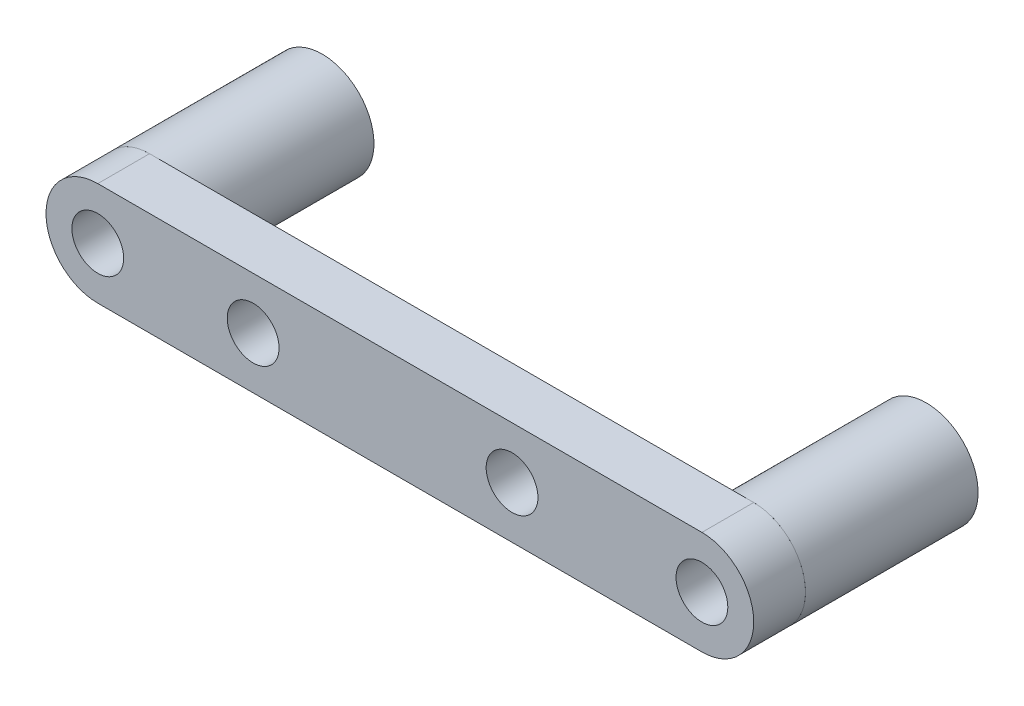
ISO-10303-21;
HEADER;
FILE_DESCRIPTION(('STEP AP214'),'2;1');
FILE_NAME('part.step','',(''),(''),'','','');
FILE_SCHEMA(('AUTOMOTIVE_DESIGN { 1 0 10303 214 1 1 1 1 }'));
ENDSEC;
DATA;
#1=APPLICATION_CONTEXT('core data for automotive mechanical design processes');
#2=APPLICATION_PROTOCOL_DEFINITION('international standard','automotive_design',2000,#1);
#3=PRODUCT_CONTEXT('',#1,'mechanical');
#4=PRODUCT('Part','Part','',(#3));
#5=PRODUCT_RELATED_PRODUCT_CATEGORY('part','',(#4));
#6=PRODUCT_DEFINITION_FORMATION('','',#4);
#7=PRODUCT_DEFINITION_CONTEXT('part definition',#1,'design');
#8=PRODUCT_DEFINITION('design','',#6,#7);
#9=PRODUCT_DEFINITION_SHAPE('','',#8);
#10=(LENGTH_UNIT() NAMED_UNIT(*) SI_UNIT(.MILLI.,.METRE.));
#11=(NAMED_UNIT(*) PLANE_ANGLE_UNIT() SI_UNIT($,.RADIAN.));
#12=(NAMED_UNIT(*) SI_UNIT($,.STERADIAN.) SOLID_ANGLE_UNIT());
#13=UNCERTAINTY_MEASURE_WITH_UNIT(LENGTH_MEASURE(1.E-05),#10,'distance_accuracy_value','');
#14=(GEOMETRIC_REPRESENTATION_CONTEXT(3) GLOBAL_UNCERTAINTY_ASSIGNED_CONTEXT((#13)) GLOBAL_UNIT_ASSIGNED_CONTEXT((#10,
#11,#12)) REPRESENTATION_CONTEXT('',''));
#15=CARTESIAN_POINT('',(0.,0.,0.));
#16=DIRECTION('',(0.,0.,1.));
#17=DIRECTION('',(1.,0.,0.));
#18=AXIS2_PLACEMENT_3D('',#15,#16,#17);
#19=CARTESIAN_POINT('',(18.5,0.,-10.));
#20=DIRECTION('',(0.,0.,-1.));
#21=DIRECTION('',(-1.,0.,0.));
#22=AXIS2_PLACEMENT_3D('',#19,#20,#21);
#23=PLANE('',#22);
#24=CARTESIAN_POINT('',(18.5,0.,-10.));
#25=DIRECTION('',(0.,0.,-1.));
#26=DIRECTION('',(-1.,0.,0.));
#27=AXIS2_PLACEMENT_3D('',#24,#25,#26);
#28=CIRCLE('',#27,3.);
#29=CARTESIAN_POINT('',(15.5,0.,-10.));
#30=VERTEX_POINT('',#29);
#31=EDGE_CURVE('E11',#30,#30,#28,.T.);
#32=ORIENTED_EDGE('',*,*,#31,.T.);
#33=EDGE_LOOP('',(#32));
#34=FACE_BOUND('',#33,.T.);
#35=CARTESIAN_POINT('',(18.5,0.,-10.));
#36=DIRECTION('',(0.,0.,-1.));
#37=DIRECTION('',(-1.,0.,0.));
#38=AXIS2_PLACEMENT_3D('',#35,#36,#37);
#39=CIRCLE('',#38,1.5);
#40=CARTESIAN_POINT('',(17.,0.,-10.));
#41=VERTEX_POINT('',#40);
#42=EDGE_CURVE('E50',#41,#41,#39,.T.);
#43=ORIENTED_EDGE('',*,*,#42,.F.);
#44=EDGE_LOOP('',(#43));
#45=FACE_BOUND('',#44,.T.);
#46=ADVANCED_FACE('F39',(#34,#45),#23,.T.);
#47=CARTESIAN_POINT('',(18.5,0.,0.));
#48=DIRECTION('',(0.,0.,-1.));
#49=DIRECTION('',(-1.,0.,0.));
#50=AXIS2_PLACEMENT_3D('',#47,#48,#49);
#51=PLANE('',#50);
#52=CARTESIAN_POINT('',(18.5,0.,0.));
#53=DIRECTION('',(0.,0.,-1.));
#54=DIRECTION('',(-1.,0.,0.));
#55=AXIS2_PLACEMENT_3D('',#52,#53,#54);
#56=CIRCLE('',#55,3.);
#57=CARTESIAN_POINT('',(15.5,0.,0.));
#58=VERTEX_POINT('',#57);
#59=EDGE_CURVE('E43',#58,#58,#56,.T.);
#60=ORIENTED_EDGE('',*,*,#59,.F.);
#61=EDGE_LOOP('',(#60));
#62=FACE_BOUND('',#61,.T.);
#63=CARTESIAN_POINT('',(18.5,0.,0.));
#64=DIRECTION('',(0.,0.,-1.));
#65=DIRECTION('',(-1.,0.,0.));
#66=AXIS2_PLACEMENT_3D('',#63,#64,#65);
#67=CIRCLE('',#66,1.5);
#68=CARTESIAN_POINT('',(17.,0.,0.));
#69=VERTEX_POINT('',#68);
#70=EDGE_CURVE('E52',#69,#69,#67,.T.);
#71=ORIENTED_EDGE('',*,*,#70,.T.);
#72=EDGE_LOOP('',(#71));
#73=FACE_BOUND('',#72,.T.);
#74=ADVANCED_FACE('F62',(#62,#73),#51,.F.);
#75=CARTESIAN_POINT('',(18.5,0.,-10.));
#76=DIRECTION('',(0.,0.,1.));
#77=DIRECTION('',(1.,0.,0.));
#78=AXIS2_PLACEMENT_3D('',#75,#76,#77);
#79=CYLINDRICAL_SURFACE('',#78,3.);
#80=ORIENTED_EDGE('',*,*,#31,.F.);
#81=EDGE_LOOP('',(#80));
#82=FACE_BOUND('',#81,.T.);
#83=ORIENTED_EDGE('',*,*,#59,.T.);
#84=EDGE_LOOP('',(#83));
#85=FACE_BOUND('',#84,.T.);
#86=ADVANCED_FACE('F41',(#82,#85),#79,.T.);
#87=CARTESIAN_POINT('',(18.5,0.,-10.));
#88=DIRECTION('',(0.,0.,1.));
#89=DIRECTION('',(1.,0.,0.));
#90=AXIS2_PLACEMENT_3D('',#87,#88,#89);
#91=CYLINDRICAL_SURFACE('',#90,1.5);
#92=ORIENTED_EDGE('',*,*,#42,.T.);
#93=EDGE_LOOP('',(#92));
#94=FACE_BOUND('',#93,.T.);
#95=ORIENTED_EDGE('',*,*,#70,.F.);
#96=EDGE_LOOP('',(#95));
#97=FACE_BOUND('',#96,.T.);
#98=ADVANCED_FACE('F58',(#94,#97),#91,.F.);
#99=CLOSED_SHELL('',(#46,#74,#86,#98));
#100=MANIFOLD_SOLID_BREP('B2',#99);
#101=CARTESIAN_POINT('',(-16.5,0.,-10.));
#102=DIRECTION('',(0.,0.,-1.));
#103=DIRECTION('',(-1.,0.,0.));
#104=AXIS2_PLACEMENT_3D('',#101,#102,#103);
#105=PLANE('',#104);
#106=CARTESIAN_POINT('',(-16.5,0.,-10.));
#107=DIRECTION('',(0.,0.,-1.));
#108=DIRECTION('',(-1.,0.,0.));
#109=AXIS2_PLACEMENT_3D('',#106,#107,#108);
#110=CIRCLE('',#109,2.99999999999999);
#111=CARTESIAN_POINT('',(-19.5,0.,-10.));
#112=VERTEX_POINT('',#111);
#113=EDGE_CURVE('E38',#112,#112,#110,.T.);
#114=ORIENTED_EDGE('',*,*,#113,.T.);
#115=EDGE_LOOP('',(#114));
#116=FACE_BOUND('',#115,.T.);
#117=CARTESIAN_POINT('',(-16.5,0.,-10.));
#118=DIRECTION('',(0.,0.,-1.));
#119=DIRECTION('',(-1.,0.,0.));
#120=AXIS2_PLACEMENT_3D('',#117,#118,#119);
#121=CIRCLE('',#120,1.5);
#122=CARTESIAN_POINT('',(-18.,0.,-10.));
#123=VERTEX_POINT('',#122);
#124=EDGE_CURVE('E120',#123,#123,#121,.T.);
#125=ORIENTED_EDGE('',*,*,#124,.F.);
#126=EDGE_LOOP('',(#125));
#127=FACE_BOUND('',#126,.T.);
#128=ADVANCED_FACE('F109',(#116,#127),#105,.T.);
#129=CARTESIAN_POINT('',(-16.5,0.,0.));
#130=DIRECTION('',(0.,0.,-1.));
#131=DIRECTION('',(-1.,0.,0.));
#132=AXIS2_PLACEMENT_3D('',#129,#130,#131);
#133=PLANE('',#132);
#134=CARTESIAN_POINT('',(-16.5,0.,0.));
#135=DIRECTION('',(0.,0.,-1.));
#136=DIRECTION('',(-1.,0.,0.));
#137=AXIS2_PLACEMENT_3D('',#134,#135,#136);
#138=CIRCLE('',#137,2.99999999999999);
#139=CARTESIAN_POINT('',(-19.5,0.,0.));
#140=VERTEX_POINT('',#139);
#141=EDGE_CURVE('E113',#140,#140,#138,.T.);
#142=ORIENTED_EDGE('',*,*,#141,.F.);
#143=EDGE_LOOP('',(#142));
#144=FACE_BOUND('',#143,.T.);
#145=CARTESIAN_POINT('',(-16.5,0.,0.));
#146=DIRECTION('',(0.,0.,-1.));
#147=DIRECTION('',(-1.,0.,0.));
#148=AXIS2_PLACEMENT_3D('',#145,#146,#147);
#149=CIRCLE('',#148,1.5);
#150=CARTESIAN_POINT('',(-18.,0.,0.));
#151=VERTEX_POINT('',#150);
#152=EDGE_CURVE('E122',#151,#151,#149,.T.);
#153=ORIENTED_EDGE('',*,*,#152,.T.);
#154=EDGE_LOOP('',(#153));
#155=FACE_BOUND('',#154,.T.);
#156=ADVANCED_FACE('F132',(#144,#155),#133,.F.);
#157=CARTESIAN_POINT('',(-16.5,0.,-10.));
#158=DIRECTION('',(0.,0.,1.));
#159=DIRECTION('',(1.,0.,0.));
#160=AXIS2_PLACEMENT_3D('',#157,#158,#159);
#161=CYLINDRICAL_SURFACE('',#160,2.99999999999999);
#162=ORIENTED_EDGE('',*,*,#113,.F.);
#163=EDGE_LOOP('',(#162));
#164=FACE_BOUND('',#163,.T.);
#165=ORIENTED_EDGE('',*,*,#141,.T.);
#166=EDGE_LOOP('',(#165));
#167=FACE_BOUND('',#166,.T.);
#168=ADVANCED_FACE('F111',(#164,#167),#161,.T.);
#169=CARTESIAN_POINT('',(-16.5,0.,-10.));
#170=DIRECTION('',(0.,0.,1.));
#171=DIRECTION('',(1.,0.,0.));
#172=AXIS2_PLACEMENT_3D('',#169,#170,#171);
#173=CYLINDRICAL_SURFACE('',#172,1.5);
#174=ORIENTED_EDGE('',*,*,#124,.T.);
#175=EDGE_LOOP('',(#174));
#176=FACE_BOUND('',#175,.T.);
#177=ORIENTED_EDGE('',*,*,#152,.F.);
#178=EDGE_LOOP('',(#177));
#179=FACE_BOUND('',#178,.T.);
#180=ADVANCED_FACE('F128',(#176,#179),#173,.F.);
#181=CLOSED_SHELL('',(#128,#156,#168,#180));
#182=MANIFOLD_SOLID_BREP('B6',#181);
#183=CARTESIAN_POINT('',(-7.5,0.,3.));
#184=DIRECTION('',(0.,0.,1.));
#185=DIRECTION('',(1.,0.,0.));
#186=AXIS2_PLACEMENT_3D('',#183,#184,#185);
#187=PLANE('',#186);
#188=CARTESIAN_POINT('',(-7.5,0.,3.));
#189=DIRECTION('',(0.,0.,1.));
#190=DIRECTION('',(1.,0.,0.));
#191=AXIS2_PLACEMENT_3D('',#188,#189,#190);
#192=CIRCLE('',#191,1.5);
#193=CARTESIAN_POINT('',(-6.,0.,3.));
#194=VERTEX_POINT('',#193);
#195=EDGE_CURVE('E261',#194,#194,#192,.T.);
#196=ORIENTED_EDGE('',*,*,#195,.F.);
#197=EDGE_LOOP('',(#196));
#198=FACE_BOUND('',#197,.T.);
#199=DIRECTION('',(-1.,0.,0.));
#200=VECTOR('',#199,1.);
#201=CARTESIAN_POINT('',(-7.5,3.,3.));
#202=LINE('',#201,#200);
#203=CARTESIAN_POINT('',(18.5,3.,3.));
#204=VERTEX_POINT('',#203);
#205=CARTESIAN_POINT('',(-16.5,3.,3.));
#206=VERTEX_POINT('',#205);
#207=EDGE_CURVE('E107',#204,#206,#202,.T.);
#208=ORIENTED_EDGE('',*,*,#207,.T.);
#209=CARTESIAN_POINT('',(-16.5,0.,3.));
#210=DIRECTION('',(0.,0.,1.));
#211=DIRECTION('',(1.,0.,0.));
#212=AXIS2_PLACEMENT_3D('',#209,#210,#211);
#213=CIRCLE('',#212,3.);
#214=CARTESIAN_POINT('',(-16.5,-3.,3.));
#215=VERTEX_POINT('',#214);
#216=EDGE_CURVE('E217',#206,#215,#213,.T.);
#217=ORIENTED_EDGE('',*,*,#216,.T.);
#218=DIRECTION('',(1.,0.,0.));
#219=VECTOR('',#218,1.);
#220=CARTESIAN_POINT('',(-7.5,-3.,3.));
#221=LINE('',#220,#219);
#222=CARTESIAN_POINT('',(18.5,-3.,3.));
#223=VERTEX_POINT('',#222);
#224=EDGE_CURVE('E179',#215,#223,#221,.T.);
#225=ORIENTED_EDGE('',*,*,#224,.T.);
#226=CARTESIAN_POINT('',(18.5,0.,3.));
#227=DIRECTION('',(0.,0.,1.));
#228=DIRECTION('',(-1.,0.,0.));
#229=AXIS2_PLACEMENT_3D('',#226,#227,#228);
#230=CIRCLE('',#229,3.);
#231=EDGE_CURVE('E215',#223,#204,#230,.T.);
#232=ORIENTED_EDGE('',*,*,#231,.T.);
#233=EDGE_LOOP('',(#208,#217,#225,#232));
#234=FACE_BOUND('',#233,.T.);
#235=CARTESIAN_POINT('',(7.5,0.,3.));
#236=DIRECTION('',(0.,0.,1.));
#237=DIRECTION('',(1.,0.,0.));
#238=AXIS2_PLACEMENT_3D('',#235,#236,#237);
#239=CIRCLE('',#238,1.5);
#240=CARTESIAN_POINT('',(9.,0.,3.));
#241=VERTEX_POINT('',#240);
#242=EDGE_CURVE('E255',#241,#241,#239,.T.);
#243=ORIENTED_EDGE('',*,*,#242,.F.);
#244=EDGE_LOOP('',(#243));
#245=FACE_BOUND('',#244,.T.);
#246=CARTESIAN_POINT('',(-16.5,0.,3.));
#247=DIRECTION('',(0.,0.,1.));
#248=DIRECTION('',(1.,0.,0.));
#249=AXIS2_PLACEMENT_3D('',#246,#247,#248);
#250=CIRCLE('',#249,1.5);
#251=CARTESIAN_POINT('',(-15.,0.,3.));
#252=VERTEX_POINT('',#251);
#253=EDGE_CURVE('E241',#252,#252,#250,.T.);
#254=ORIENTED_EDGE('',*,*,#253,.F.);
#255=EDGE_LOOP('',(#254));
#256=FACE_BOUND('',#255,.T.);
#257=CARTESIAN_POINT('',(18.5,0.,3.));
#258=DIRECTION('',(0.,0.,1.));
#259=DIRECTION('',(1.,0.,0.));
#260=AXIS2_PLACEMENT_3D('',#257,#258,#259);
#261=CIRCLE('',#260,1.5);
#262=CARTESIAN_POINT('',(20.,0.,3.));
#263=VERTEX_POINT('',#262);
#264=EDGE_CURVE('E230',#263,#263,#261,.T.);
#265=ORIENTED_EDGE('',*,*,#264,.F.);
#266=EDGE_LOOP('',(#265));
#267=FACE_BOUND('',#266,.T.);
#268=ADVANCED_FACE('F170',(#198,#234,#245,#256,#267),#187,.T.);
#269=CARTESIAN_POINT('',(-7.5,0.,0.));
#270=DIRECTION('',(0.,0.,1.));
#271=DIRECTION('',(1.,0.,0.));
#272=AXIS2_PLACEMENT_3D('',#269,#270,#271);
#273=PLANE('',#272);
#274=DIRECTION('',(1.,0.,0.));
#275=VECTOR('',#274,1.);
#276=CARTESIAN_POINT('',(-7.5,-3.,0.));
#277=LINE('',#276,#275);
#278=CARTESIAN_POINT('',(-16.5,-3.,0.));
#279=VERTEX_POINT('',#278);
#280=CARTESIAN_POINT('',(18.5,-3.,0.));
#281=VERTEX_POINT('',#280);
#282=EDGE_CURVE('E187',#279,#281,#277,.T.);
#283=ORIENTED_EDGE('',*,*,#282,.F.);
#284=CARTESIAN_POINT('',(-16.5,0.,0.));
#285=DIRECTION('',(0.,0.,1.));
#286=DIRECTION('',(1.,0.,0.));
#287=AXIS2_PLACEMENT_3D('',#284,#285,#286);
#288=CIRCLE('',#287,3.);
#289=CARTESIAN_POINT('',(-16.5,3.,0.));
#290=VERTEX_POINT('',#289);
#291=EDGE_CURVE('E242',#279,#290,#288,.F.);
#292=ORIENTED_EDGE('',*,*,#291,.T.);
#293=DIRECTION('',(-1.,0.,0.));
#294=VECTOR('',#293,1.);
#295=CARTESIAN_POINT('',(-7.5,3.,0.));
#296=LINE('',#295,#294);
#297=CARTESIAN_POINT('',(18.5,3.,0.));
#298=VERTEX_POINT('',#297);
#299=EDGE_CURVE('E174',#298,#290,#296,.T.);
#300=ORIENTED_EDGE('',*,*,#299,.F.);
#301=CARTESIAN_POINT('',(18.5,0.,0.));
#302=DIRECTION('',(0.,0.,1.));
#303=DIRECTION('',(1.,0.,0.));
#304=AXIS2_PLACEMENT_3D('',#301,#302,#303);
#305=CIRCLE('',#304,3.);
#306=EDGE_CURVE('E236',#298,#281,#305,.F.);
#307=ORIENTED_EDGE('',*,*,#306,.T.);
#308=EDGE_LOOP('',(#283,#292,#300,#307));
#309=FACE_BOUND('',#308,.T.);
#310=CARTESIAN_POINT('',(-7.5,0.,0.));
#311=DIRECTION('',(0.,0.,1.));
#312=DIRECTION('',(1.,0.,0.));
#313=AXIS2_PLACEMENT_3D('',#310,#311,#312);
#314=CIRCLE('',#313,1.5);
#315=CARTESIAN_POINT('',(-6.,0.,0.));
#316=VERTEX_POINT('',#315);
#317=EDGE_CURVE('E258',#316,#316,#314,.T.);
#318=ORIENTED_EDGE('',*,*,#317,.T.);
#319=EDGE_LOOP('',(#318));
#320=FACE_BOUND('',#319,.T.);
#321=CARTESIAN_POINT('',(7.5,0.,0.));
#322=DIRECTION('',(0.,0.,1.));
#323=DIRECTION('',(1.,0.,0.));
#324=AXIS2_PLACEMENT_3D('',#321,#322,#323);
#325=CIRCLE('',#324,1.5);
#326=CARTESIAN_POINT('',(9.,0.,0.));
#327=VERTEX_POINT('',#326);
#328=EDGE_CURVE('E254',#327,#327,#325,.T.);
#329=ORIENTED_EDGE('',*,*,#328,.T.);
#330=EDGE_LOOP('',(#329));
#331=FACE_BOUND('',#330,.T.);
#332=CARTESIAN_POINT('',(-16.5,0.,0.));
#333=DIRECTION('',(0.,0.,1.));
#334=DIRECTION('',(1.,0.,0.));
#335=AXIS2_PLACEMENT_3D('',#332,#333,#334);
#336=CIRCLE('',#335,1.5);
#337=CARTESIAN_POINT('',(-15.,0.,0.));
#338=VERTEX_POINT('',#337);
#339=EDGE_CURVE('E244',#338,#338,#336,.F.);
#340=ORIENTED_EDGE('',*,*,#339,.F.);
#341=EDGE_LOOP('',(#340));
#342=FACE_BOUND('',#341,.T.);
#343=CARTESIAN_POINT('',(18.5,0.,0.));
#344=DIRECTION('',(0.,0.,1.));
#345=DIRECTION('',(1.,0.,0.));
#346=AXIS2_PLACEMENT_3D('',#343,#344,#345);
#347=CIRCLE('',#346,1.5);
#348=CARTESIAN_POINT('',(20.,0.,0.));
#349=VERTEX_POINT('',#348);
#350=EDGE_CURVE('E238',#349,#349,#347,.F.);
#351=ORIENTED_EDGE('',*,*,#350,.F.);
#352=EDGE_LOOP('',(#351));
#353=FACE_BOUND('',#352,.T.);
#354=ADVANCED_FACE('F267',(#309,#320,#331,#342,#353),#273,.F.);
#355=CARTESIAN_POINT('',(-7.5,-3.,3.));
#356=DIRECTION('',(0.,1.,0.));
#357=DIRECTION('',(-1.,0.,0.));
#358=AXIS2_PLACEMENT_3D('',#355,#356,#357);
#359=PLANE('',#358);
#360=ORIENTED_EDGE('',*,*,#282,.T.);
#361=DIRECTION('',(0.,0.,1.));
#362=VECTOR('',#361,1.);
#363=CARTESIAN_POINT('',(18.5,-3.,-15.2315462117278));
#364=LINE('',#363,#362);
#365=EDGE_CURVE('E223',#281,#223,#364,.T.);
#366=ORIENTED_EDGE('',*,*,#365,.T.);
#367=ORIENTED_EDGE('',*,*,#224,.F.);
#368=DIRECTION('',(0.,0.,1.));
#369=VECTOR('',#368,1.);
#370=CARTESIAN_POINT('',(-16.5,-3.,-15.2315462117278));
#371=LINE('',#370,#369);
#372=EDGE_CURVE('E245',#279,#215,#371,.T.);
#373=ORIENTED_EDGE('',*,*,#372,.F.);
#374=EDGE_LOOP('',(#360,#366,#367,#373));
#375=FACE_BOUND('',#374,.T.);
#376=ADVANCED_FACE('F172',(#375),#359,.F.);
#377=CARTESIAN_POINT('',(-7.5,3.,3.));
#378=DIRECTION('',(0.,-1.,0.));
#379=DIRECTION('',(1.,0.,0.));
#380=AXIS2_PLACEMENT_3D('',#377,#378,#379);
#381=PLANE('',#380);
#382=ORIENTED_EDGE('',*,*,#299,.T.);
#383=DIRECTION('',(0.,0.,1.));
#384=VECTOR('',#383,1.);
#385=CARTESIAN_POINT('',(-16.5,3.,-15.2315462117278));
#386=LINE('',#385,#384);
#387=EDGE_CURVE('E249',#290,#206,#386,.T.);
#388=ORIENTED_EDGE('',*,*,#387,.T.);
#389=ORIENTED_EDGE('',*,*,#207,.F.);
#390=DIRECTION('',(0.,0.,1.));
#391=VECTOR('',#390,1.);
#392=CARTESIAN_POINT('',(18.5,3.,-15.2315462117278));
#393=LINE('',#392,#391);
#394=EDGE_CURVE('E226',#298,#204,#393,.T.);
#395=ORIENTED_EDGE('',*,*,#394,.F.);
#396=EDGE_LOOP('',(#382,#388,#389,#395));
#397=FACE_BOUND('',#396,.T.);
#398=ADVANCED_FACE('F273',(#397),#381,.F.);
#399=CARTESIAN_POINT('',(-7.5,0.,3.));
#400=DIRECTION('',(0.,0.,-1.));
#401=DIRECTION('',(-1.,0.,0.));
#402=AXIS2_PLACEMENT_3D('',#399,#400,#401);
#403=CYLINDRICAL_SURFACE('',#402,1.5);
#404=ORIENTED_EDGE('',*,*,#195,.T.);
#405=EDGE_LOOP('',(#404));
#406=FACE_BOUND('',#405,.T.);
#407=ORIENTED_EDGE('',*,*,#317,.F.);
#408=EDGE_LOOP('',(#407));
#409=FACE_BOUND('',#408,.T.);
#410=ADVANCED_FACE('F270',(#406,#409),#403,.F.);
#411=CARTESIAN_POINT('',(7.5,0.,3.));
#412=DIRECTION('',(0.,0.,-1.));
#413=DIRECTION('',(-1.,0.,0.));
#414=AXIS2_PLACEMENT_3D('',#411,#412,#413);
#415=CYLINDRICAL_SURFACE('',#414,1.5);
#416=ORIENTED_EDGE('',*,*,#242,.T.);
#417=EDGE_LOOP('',(#416));
#418=FACE_BOUND('',#417,.T.);
#419=ORIENTED_EDGE('',*,*,#328,.F.);
#420=EDGE_LOOP('',(#419));
#421=FACE_BOUND('',#420,.T.);
#422=ADVANCED_FACE('F272',(#418,#421),#415,.F.);
#423=CARTESIAN_POINT('',(-16.5,0.,-15.2315462117278));
#424=DIRECTION('',(0.,0.,1.));
#425=DIRECTION('',(1.,0.,0.));
#426=AXIS2_PLACEMENT_3D('',#423,#424,#425);
#427=CYLINDRICAL_SURFACE('',#426,3.);
#428=ORIENTED_EDGE('',*,*,#291,.F.);
#429=ORIENTED_EDGE('',*,*,#372,.T.);
#430=ORIENTED_EDGE('',*,*,#216,.F.);
#431=ORIENTED_EDGE('',*,*,#387,.F.);
#432=EDGE_LOOP('',(#428,#429,#430,#431));
#433=FACE_BOUND('',#432,.T.);
#434=ADVANCED_FACE('F280',(#433),#427,.T.);
#435=CARTESIAN_POINT('',(-16.5,0.,-15.2315462117278));
#436=DIRECTION('',(0.,0.,1.));
#437=DIRECTION('',(1.,0.,0.));
#438=AXIS2_PLACEMENT_3D('',#435,#436,#437);
#439=CYLINDRICAL_SURFACE('',#438,1.5);
#440=ORIENTED_EDGE('',*,*,#339,.T.);
#441=EDGE_LOOP('',(#440));
#442=FACE_BOUND('',#441,.T.);
#443=ORIENTED_EDGE('',*,*,#253,.T.);
#444=EDGE_LOOP('',(#443));
#445=FACE_BOUND('',#444,.T.);
#446=ADVANCED_FACE('F310',(#442,#445),#439,.F.);
#447=CARTESIAN_POINT('',(18.5,0.,-15.2315462117278));
#448=DIRECTION('',(0.,0.,1.));
#449=DIRECTION('',(1.,0.,0.));
#450=AXIS2_PLACEMENT_3D('',#447,#448,#449);
#451=CYLINDRICAL_SURFACE('',#450,3.);
#452=ORIENTED_EDGE('',*,*,#306,.F.);
#453=ORIENTED_EDGE('',*,*,#394,.T.);
#454=ORIENTED_EDGE('',*,*,#231,.F.);
#455=ORIENTED_EDGE('',*,*,#365,.F.);
#456=EDGE_LOOP('',(#452,#453,#454,#455));
#457=FACE_BOUND('',#456,.T.);
#458=ADVANCED_FACE('F229',(#457),#451,.T.);
#459=CARTESIAN_POINT('',(18.5,0.,-15.2315462117278));
#460=DIRECTION('',(0.,0.,1.));
#461=DIRECTION('',(1.,0.,0.));
#462=AXIS2_PLACEMENT_3D('',#459,#460,#461);
#463=CYLINDRICAL_SURFACE('',#462,1.5);
#464=ORIENTED_EDGE('',*,*,#350,.T.);
#465=EDGE_LOOP('',(#464));
#466=FACE_BOUND('',#465,.T.);
#467=ORIENTED_EDGE('',*,*,#264,.T.);
#468=EDGE_LOOP('',(#467));
#469=FACE_BOUND('',#468,.T.);
#470=ADVANCED_FACE('F329',(#466,#469),#463,.F.);
#471=CLOSED_SHELL('',(#268,#354,#376,#398,#410,#422,#434,#446,#458,#470));
#472=MANIFOLD_SOLID_BREP('B33',#471);
#473=ADVANCED_BREP_SHAPE_REPRESENTATION('',(#18,#100,#182,#472),#14);
#474=SHAPE_DEFINITION_REPRESENTATION(#9,#473);
ENDSEC;
END-ISO-10303-21;
